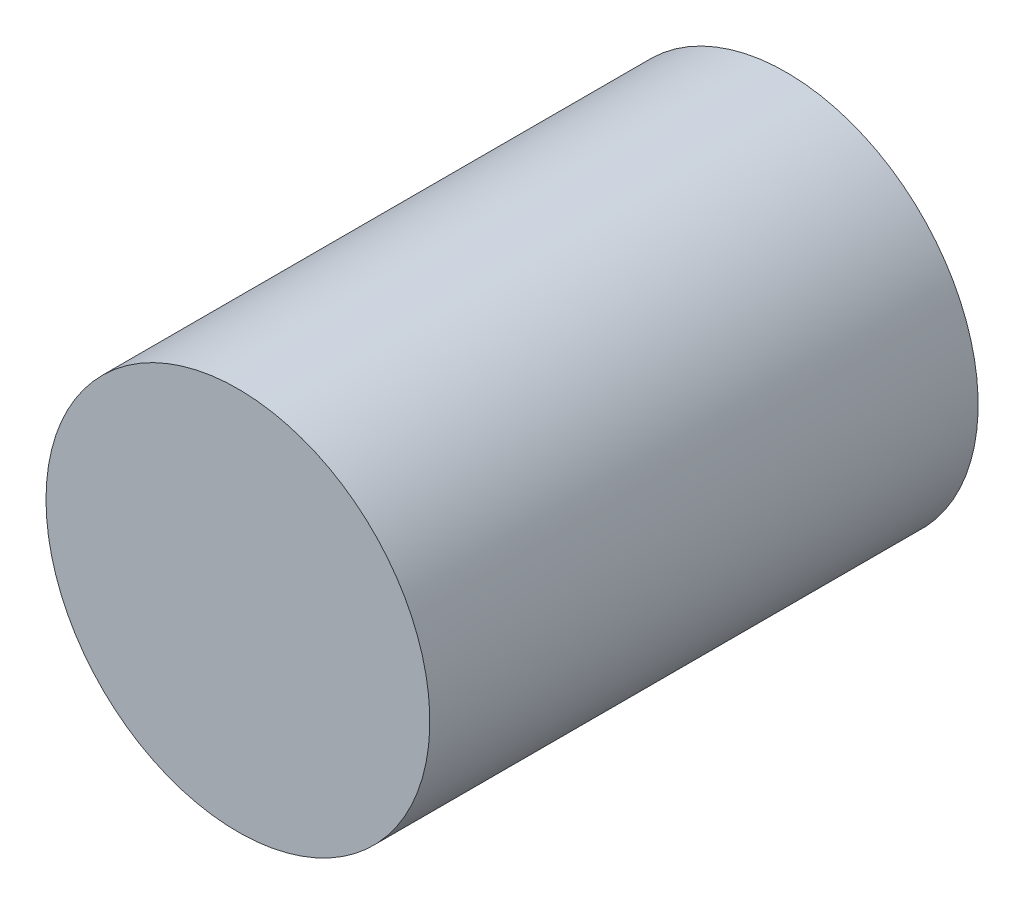
ISO-10303-21;
HEADER;
FILE_DESCRIPTION(('STEP AP214'),'2;1');
FILE_NAME('part.step','',(''),(''),'','','');
FILE_SCHEMA(('AUTOMOTIVE_DESIGN { 1 0 10303 214 1 1 1 1 }'));
ENDSEC;
DATA;
#1=APPLICATION_CONTEXT('core data for automotive mechanical design processes');
#2=APPLICATION_PROTOCOL_DEFINITION('international standard','automotive_design',2000,#1);
#3=PRODUCT_CONTEXT('',#1,'mechanical');
#4=PRODUCT('Part','Part','',(#3));
#5=PRODUCT_RELATED_PRODUCT_CATEGORY('part','',(#4));
#6=PRODUCT_DEFINITION_FORMATION('','',#4);
#7=PRODUCT_DEFINITION_CONTEXT('part definition',#1,'design');
#8=PRODUCT_DEFINITION('design','',#6,#7);
#9=PRODUCT_DEFINITION_SHAPE('','',#8);
#10=(LENGTH_UNIT() NAMED_UNIT(*) SI_UNIT(.MILLI.,.METRE.));
#11=(NAMED_UNIT(*) PLANE_ANGLE_UNIT() SI_UNIT($,.RADIAN.));
#12=(NAMED_UNIT(*) SI_UNIT($,.STERADIAN.) SOLID_ANGLE_UNIT());
#13=UNCERTAINTY_MEASURE_WITH_UNIT(LENGTH_MEASURE(1.E-05),#10,'distance_accuracy_value','');
#14=(GEOMETRIC_REPRESENTATION_CONTEXT(3) GLOBAL_UNCERTAINTY_ASSIGNED_CONTEXT((#13)) GLOBAL_UNIT_ASSIGNED_CONTEXT((#10,
#11,#12)) REPRESENTATION_CONTEXT('',''));
#15=CARTESIAN_POINT('',(0.,0.,0.));
#16=DIRECTION('',(0.,0.,1.));
#17=DIRECTION('',(1.,0.,0.));
#18=AXIS2_PLACEMENT_3D('',#15,#16,#17);
#19=CARTESIAN_POINT('',(0.,0.,12.7));
#20=DIRECTION('',(0.,0.,-1.));
#21=DIRECTION('',(-1.,0.,0.));
#22=AXIS2_PLACEMENT_3D('',#19,#20,#21);
#23=CYLINDRICAL_SURFACE('',#22,4.445);
#24=CARTESIAN_POINT('',(0.,0.,12.7));
#25=DIRECTION('',(0.,0.,1.));
#26=DIRECTION('',(1.,0.,0.));
#27=AXIS2_PLACEMENT_3D('',#24,#25,#26);
#28=CIRCLE('',#27,4.445);
#29=CARTESIAN_POINT('',(-4.445,0.,12.7));
#30=VERTEX_POINT('',#29);
#31=EDGE_CURVE('E10',#30,#30,#28,.T.);
#32=CARTESIAN_POINT('',(0.,0.,0.));
#33=DIRECTION('',(0.,0.,1.));
#34=DIRECTION('',(1.,0.,0.));
#35=AXIS2_PLACEMENT_3D('',#32,#33,#34);
#36=CIRCLE('',#35,4.445);
#37=CARTESIAN_POINT('',(-4.445,0.,0.));
#38=VERTEX_POINT('',#37);
#39=EDGE_CURVE('E35',#38,#38,#36,.T.);
#40=CARTESIAN_POINT('',(-4.445,0.,12.7));
#41=CARTESIAN_POINT('',(-4.445,0.,12.5677083333333));
#42=CARTESIAN_POINT('',(-4.445,0.,12.4354166666667));
#43=CARTESIAN_POINT('',(-4.445,0.,12.1708333333333));
#44=CARTESIAN_POINT('',(-4.445,0.,12.0385416666667));
#45=CARTESIAN_POINT('',(-4.445,0.,11.7739583333333));
#46=CARTESIAN_POINT('',(-4.445,0.,11.6416666666667));
#47=CARTESIAN_POINT('',(-4.445,0.,11.3770833333333));
#48=CARTESIAN_POINT('',(-4.445,0.,11.2447916666667));
#49=CARTESIAN_POINT('',(-4.445,0.,10.9802083333333));
#50=CARTESIAN_POINT('',(-4.445,0.,10.8479166666667));
#51=CARTESIAN_POINT('',(-4.445,0.,10.5833333333333));
#52=CARTESIAN_POINT('',(-4.445,0.,10.4510416666667));
#53=CARTESIAN_POINT('',(-4.445,0.,10.1864583333333));
#54=CARTESIAN_POINT('',(-4.445,0.,10.0541666666667));
#55=CARTESIAN_POINT('',(-4.445,0.,9.78958333333333));
#56=CARTESIAN_POINT('',(-4.445,0.,9.65729166666667));
#57=CARTESIAN_POINT('',(-4.445,0.,9.39270833333333));
#58=CARTESIAN_POINT('',(-4.445,0.,9.26041666666667));
#59=CARTESIAN_POINT('',(-4.445,0.,8.99583333333334));
#60=CARTESIAN_POINT('',(-4.445,0.,8.86354166666667));
#61=CARTESIAN_POINT('',(-4.445,0.,8.59895833333334));
#62=CARTESIAN_POINT('',(-4.445,0.,8.46666666666667));
#63=CARTESIAN_POINT('',(-4.445,0.,8.20208333333333));
#64=CARTESIAN_POINT('',(-4.445,0.,8.06979166666667));
#65=CARTESIAN_POINT('',(-4.445,0.,7.80520833333333));
#66=CARTESIAN_POINT('',(-4.445,0.,7.67291666666667));
#67=CARTESIAN_POINT('',(-4.445,0.,7.40833333333333));
#68=CARTESIAN_POINT('',(-4.445,0.,7.27604166666667));
#69=CARTESIAN_POINT('',(-4.445,0.,7.01145833333333));
#70=CARTESIAN_POINT('',(-4.445,0.,6.87916666666667));
#71=CARTESIAN_POINT('',(-4.445,0.,6.61458333333333));
#72=CARTESIAN_POINT('',(-4.445,0.,6.48229166666667));
#73=CARTESIAN_POINT('',(-4.445,0.,6.21770833333333));
#74=CARTESIAN_POINT('',(-4.445,0.,6.08541666666667));
#75=CARTESIAN_POINT('',(-4.445,0.,5.82083333333333));
#76=CARTESIAN_POINT('',(-4.445,0.,5.68854166666667));
#77=CARTESIAN_POINT('',(-4.445,0.,5.42395833333333));
#78=CARTESIAN_POINT('',(-4.445,0.,5.29166666666667));
#79=CARTESIAN_POINT('',(-4.445,0.,5.02708333333333));
#80=CARTESIAN_POINT('',(-4.445,0.,4.89479166666667));
#81=CARTESIAN_POINT('',(-4.445,0.,4.63020833333333));
#82=CARTESIAN_POINT('',(-4.445,0.,4.49791666666667));
#83=CARTESIAN_POINT('',(-4.445,0.,4.23333333333333));
#84=CARTESIAN_POINT('',(-4.445,0.,4.10104166666667));
#85=CARTESIAN_POINT('',(-4.445,0.,3.83645833333333));
#86=CARTESIAN_POINT('',(-4.445,0.,3.70416666666667));
#87=CARTESIAN_POINT('',(-4.445,0.,3.43958333333333));
#88=CARTESIAN_POINT('',(-4.445,0.,3.30729166666667));
#89=CARTESIAN_POINT('',(-4.445,0.,3.04270833333333));
#90=CARTESIAN_POINT('',(-4.445,0.,2.91041666666667));
#91=CARTESIAN_POINT('',(-4.445,0.,2.64583333333333));
#92=CARTESIAN_POINT('',(-4.445,0.,2.51354166666667));
#93=CARTESIAN_POINT('',(-4.445,0.,2.24895833333333));
#94=CARTESIAN_POINT('',(-4.445,0.,2.11666666666667));
#95=CARTESIAN_POINT('',(-4.445,0.,1.85208333333333));
#96=CARTESIAN_POINT('',(-4.445,0.,1.71979166666667));
#97=CARTESIAN_POINT('',(-4.445,0.,1.45520833333333));
#98=CARTESIAN_POINT('',(-4.445,0.,1.32291666666667));
#99=CARTESIAN_POINT('',(-4.445,0.,1.05833333333333));
#100=CARTESIAN_POINT('',(-4.445,0.,0.926041666666666));
#101=CARTESIAN_POINT('',(-4.445,0.,0.661458333333333));
#102=CARTESIAN_POINT('',(-4.445,0.,0.529166666666666));
#103=CARTESIAN_POINT('',(-4.445,0.,0.264583333333333));
#104=CARTESIAN_POINT('',(-4.445,0.,0.132291666666667));
#105=CARTESIAN_POINT('',(-4.445,0.,0.));
#106=B_SPLINE_CURVE_WITH_KNOTS('',3,(#40,#41,#42,#43,#44,#45,#46,#47,#48,#49,#50,#51,#52,#53,
#54,#55,#56,#57,#58,#59,#60,#61,#62,#63,#64,#65,#66,#67,#68,#69,#70,#71,#72,#73,#74,#75,#76,#77,
#78,#79,#80,#81,#82,#83,#84,#85,#86,#87,#88,#89,#90,#91,#92,#93,#94,#95,#96,#97,#98,#99,#100,
#101,#102,#103,#104,#105),.UNSPECIFIED.,.F.,.F.,(4,2,2,2,2,2,2,2,2,2,2,2,2,2,2,2,2,2,2,2,2,2,2,
2,2,2,2,2,2,2,2,2,4),(0.,0.396875,0.793749999999999,1.190625,1.5875,1.984375,2.38125,2.778125,
3.175,3.571875,3.96875,4.365625,4.7625,5.159375,5.55625,5.953125,6.35,6.746875,7.14375,7.540625,
7.9375,8.334375,8.73125,9.128125,9.525,9.921875,10.31875,10.715625,11.1125,11.509375,11.90625,
12.303125,12.7),.UNSPECIFIED.);
#107=EDGE_CURVE('BSEAM32',#30,#38,#106,.T.);
#108=ORIENTED_EDGE('',*,*,#31,.F.);
#109=ORIENTED_EDGE('',*,*,#39,.T.);
#110=ORIENTED_EDGE('',*,*,#107,.T.);
#111=ORIENTED_EDGE('',*,*,#107,.F.);
#112=EDGE_LOOP('',(#108,#110,#109,#111));
#113=FACE_BOUND('',#112,.T.);
#114=ADVANCED_FACE('F32',(#113),#23,.T.);
#115=CARTESIAN_POINT('',(0.,0.,12.7));
#116=DIRECTION('',(0.,0.,1.));
#117=DIRECTION('',(1.,0.,0.));
#118=AXIS2_PLACEMENT_3D('',#115,#116,#117);
#119=PLANE('',#118);
#120=ORIENTED_EDGE('',*,*,#31,.T.);
#121=EDGE_LOOP('',(#120));
#122=FACE_BOUND('',#121,.T.);
#123=ADVANCED_FACE('F47',(#122),#119,.T.);
#124=CARTESIAN_POINT('',(0.,0.,0.));
#125=DIRECTION('',(0.,0.,1.));
#126=DIRECTION('',(1.,0.,0.));
#127=AXIS2_PLACEMENT_3D('',#124,#125,#126);
#128=PLANE('',#127);
#129=ORIENTED_EDGE('',*,*,#39,.F.);
#130=EDGE_LOOP('',(#129));
#131=FACE_BOUND('',#130,.T.);
#132=ADVANCED_FACE('F45',(#131),#128,.F.);
#133=CLOSED_SHELL('',(#114,#123,#132));
#134=MANIFOLD_SOLID_BREP('B2',#133);
#135=ADVANCED_BREP_SHAPE_REPRESENTATION('',(#18,#134),#14);
#136=SHAPE_DEFINITION_REPRESENTATION(#9,#135);
ENDSEC;
END-ISO-10303-21;
